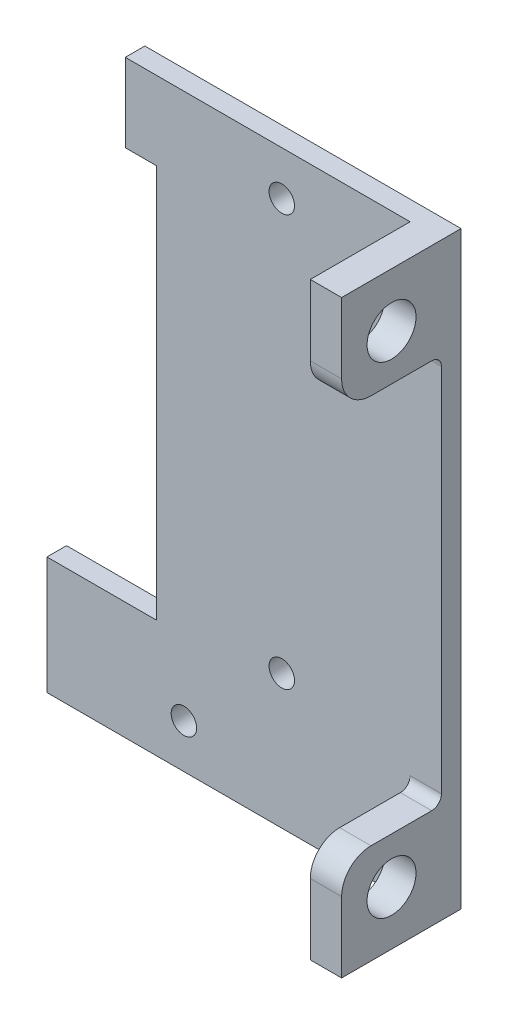
ISO-10303-21;
HEADER;
FILE_DESCRIPTION(('STEP AP214'),'2;1');
FILE_NAME('part.step','',(''),(''),'','','');
FILE_SCHEMA(('AUTOMOTIVE_DESIGN { 1 0 10303 214 1 1 1 1 }'));
ENDSEC;
DATA;
#1=APPLICATION_CONTEXT('core data for automotive mechanical design processes');
#2=APPLICATION_PROTOCOL_DEFINITION('international standard','automotive_design',2000,#1);
#3=PRODUCT_CONTEXT('',#1,'mechanical');
#4=PRODUCT('Part','Part','',(#3));
#5=PRODUCT_RELATED_PRODUCT_CATEGORY('part','',(#4));
#6=PRODUCT_DEFINITION_FORMATION('','',#4);
#7=PRODUCT_DEFINITION_CONTEXT('part definition',#1,'design');
#8=PRODUCT_DEFINITION('design','',#6,#7);
#9=PRODUCT_DEFINITION_SHAPE('','',#8);
#10=(LENGTH_UNIT() NAMED_UNIT(*) SI_UNIT(.MILLI.,.METRE.));
#11=(NAMED_UNIT(*) PLANE_ANGLE_UNIT() SI_UNIT($,.RADIAN.));
#12=(NAMED_UNIT(*) SI_UNIT($,.STERADIAN.) SOLID_ANGLE_UNIT());
#13=UNCERTAINTY_MEASURE_WITH_UNIT(LENGTH_MEASURE(1.E-05),#10,'distance_accuracy_value','');
#14=(GEOMETRIC_REPRESENTATION_CONTEXT(3) GLOBAL_UNCERTAINTY_ASSIGNED_CONTEXT((#13)) GLOBAL_UNIT_ASSIGNED_CONTEXT((#10,
#11,#12)) REPRESENTATION_CONTEXT('',''));
#15=CARTESIAN_POINT('',(0.,0.,0.));
#16=DIRECTION('',(0.,0.,1.));
#17=DIRECTION('',(1.,0.,0.));
#18=AXIS2_PLACEMENT_3D('',#15,#16,#17);
#19=CARTESIAN_POINT('',(21.7999999776483,11.2000001899898,22.1999996647239));
#20=DIRECTION('',(-1.,0.,0.));
#21=DIRECTION('',(0.,0.,1.));
#22=AXIS2_PLACEMENT_3D('',#19,#20,#21);
#23=CYLINDRICAL_SURFACE('',#22,3.);
#24=DIRECTION('',(1.,0.,0.));
#25=VECTOR('',#24,1.);
#26=CARTESIAN_POINT('',(21.7999999776483,14.2000001899898,22.1999996647239));
#27=LINE('',#26,#25);
#28=CARTESIAN_POINT('',(18.5999999776483,14.2000001899898,22.1999996647239));
#29=VERTEX_POINT('',#28);
#30=CARTESIAN_POINT('',(21.7999999776483,14.2000001899898,22.1999996647239));
#31=VERTEX_POINT('',#30);
#32=EDGE_CURVE('E314',#29,#31,#27,.T.);
#33=ORIENTED_EDGE('',*,*,#32,.F.);
#34=CARTESIAN_POINT('',(18.5999999776483,11.2000001899898,22.1999996647239));
#35=DIRECTION('',(1.,0.,0.));
#36=DIRECTION('',(0.,1.,0.));
#37=AXIS2_PLACEMENT_3D('',#34,#35,#36);
#38=CIRCLE('',#37,3.);
#39=CARTESIAN_POINT('',(18.5999999776483,11.2000001899898,25.1999996647239));
#40=VERTEX_POINT('',#39);
#41=EDGE_CURVE('E52',#40,#29,#38,.F.);
#42=ORIENTED_EDGE('',*,*,#41,.F.);
#43=DIRECTION('',(1.,0.,0.));
#44=VECTOR('',#43,1.);
#45=CARTESIAN_POINT('',(21.7999999776483,11.2000001899898,25.1999996647239));
#46=LINE('',#45,#44);
#47=CARTESIAN_POINT('',(21.7999999776483,11.2000001899898,25.1999996647239));
#48=VERTEX_POINT('',#47);
#49=EDGE_CURVE('E318',#48,#40,#46,.F.);
#50=ORIENTED_EDGE('',*,*,#49,.F.);
#51=CARTESIAN_POINT('',(21.7999999776483,11.2000001899898,22.1999996647239));
#52=DIRECTION('',(-1.,0.,0.));
#53=DIRECTION('',(0.,0.,1.));
#54=AXIS2_PLACEMENT_3D('',#51,#52,#53);
#55=CIRCLE('',#54,3.);
#56=EDGE_CURVE('E12',#31,#48,#55,.F.);
#57=ORIENTED_EDGE('',*,*,#56,.F.);
#58=EDGE_LOOP('',(#33,#42,#50,#57));
#59=FACE_BOUND('',#58,.T.);
#60=ADVANCED_FACE('F44',(#59),#23,.T.);
#61=CARTESIAN_POINT('',(0.,57.0000003799796,22.1999996647239));
#62=DIRECTION('',(1.,0.,0.));
#63=DIRECTION('',(0.,0.,-1.));
#64=AXIS2_PLACEMENT_3D('',#61,#62,#63);
#65=CYLINDRICAL_SURFACE('',#64,3.);
#66=DIRECTION('',(1.,0.,0.));
#67=VECTOR('',#66,1.);
#68=CARTESIAN_POINT('',(0.,57.0000003799796,25.1999996647239));
#69=LINE('',#68,#67);
#70=CARTESIAN_POINT('',(18.5999999776483,57.0000003799796,25.1999996647239));
#71=VERTEX_POINT('',#70);
#72=CARTESIAN_POINT('',(21.7999999776483,57.0000003799796,25.1999996647239));
#73=VERTEX_POINT('',#72);
#74=EDGE_CURVE('E277',#71,#73,#69,.T.);
#75=ORIENTED_EDGE('',*,*,#74,.F.);
#76=CARTESIAN_POINT('',(18.5999999776483,57.0000003799796,22.1999996647239));
#77=DIRECTION('',(1.,0.,0.));
#78=DIRECTION('',(0.,0.,-1.));
#79=AXIS2_PLACEMENT_3D('',#76,#77,#78);
#80=CIRCLE('',#79,3.);
#81=CARTESIAN_POINT('',(18.5999999776483,54.0000003799796,22.1999996647239));
#82=VERTEX_POINT('',#81);
#83=EDGE_CURVE('E308',#82,#71,#80,.F.);
#84=ORIENTED_EDGE('',*,*,#83,.F.);
#85=DIRECTION('',(1.,0.,0.));
#86=VECTOR('',#85,1.);
#87=CARTESIAN_POINT('',(21.7999999776483,54.0000003799796,22.1999996647239));
#88=LINE('',#87,#86);
#89=CARTESIAN_POINT('',(21.7999999776483,54.0000003799796,22.1999996647239));
#90=VERTEX_POINT('',#89);
#91=EDGE_CURVE('E304',#90,#82,#88,.F.);
#92=ORIENTED_EDGE('',*,*,#91,.F.);
#93=CARTESIAN_POINT('',(21.7999999776483,57.0000003799796,22.1999996647239));
#94=DIRECTION('',(-1.,0.,0.));
#95=DIRECTION('',(0.,0.,1.));
#96=AXIS2_PLACEMENT_3D('',#93,#94,#95);
#97=CIRCLE('',#96,3.);
#98=EDGE_CURVE('E311',#73,#90,#97,.F.);
#99=ORIENTED_EDGE('',*,*,#98,.F.);
#100=EDGE_LOOP('',(#75,#84,#92,#99));
#101=FACE_BOUND('',#100,.T.);
#102=ADVANCED_FACE('F409',(#101),#65,.T.);
#103=CARTESIAN_POINT('',(21.7999999776483,15.2000001899898,15.9999996647239));
#104=DIRECTION('',(-1.,0.,0.));
#105=DIRECTION('',(0.,0.,1.));
#106=AXIS2_PLACEMENT_3D('',#103,#104,#105);
#107=CYLINDRICAL_SURFACE('',#106,1.);
#108=DIRECTION('',(-1.,0.,0.));
#109=VECTOR('',#108,1.);
#110=CARTESIAN_POINT('',(21.7999999776483,14.2000001899898,15.9999996647239));
#111=LINE('',#110,#109);
#112=CARTESIAN_POINT('',(21.7999999776483,14.2000001899898,15.9999996647239));
#113=VERTEX_POINT('',#112);
#114=CARTESIAN_POINT('',(18.5999999776483,14.2000001899898,15.9999996647239));
#115=VERTEX_POINT('',#114);
#116=EDGE_CURVE('E250',#113,#115,#111,.T.);
#117=ORIENTED_EDGE('',*,*,#116,.F.);
#118=CARTESIAN_POINT('',(21.7999999776483,15.2000001899898,15.9999996647239));
#119=DIRECTION('',(-1.,0.,0.));
#120=DIRECTION('',(0.,0.,1.));
#121=AXIS2_PLACEMENT_3D('',#118,#119,#120);
#122=CIRCLE('',#121,1.);
#123=CARTESIAN_POINT('',(21.7999999776483,15.2000001899898,14.9999996647239));
#124=VERTEX_POINT('',#123);
#125=EDGE_CURVE('E258',#113,#124,#122,.F.);
#126=ORIENTED_EDGE('',*,*,#125,.T.);
#127=DIRECTION('',(-1.,0.,0.));
#128=VECTOR('',#127,1.);
#129=CARTESIAN_POINT('',(0.,15.2000001899898,14.9999996647239));
#130=LINE('',#129,#128);
#131=CARTESIAN_POINT('',(18.5999999776483,15.2000001899898,14.9999996647239));
#132=VERTEX_POINT('',#131);
#133=EDGE_CURVE('E254',#132,#124,#130,.F.);
#134=ORIENTED_EDGE('',*,*,#133,.F.);
#135=CARTESIAN_POINT('',(18.5999999776483,15.2000001899898,15.9999996647239));
#136=DIRECTION('',(1.,0.,0.));
#137=DIRECTION('',(0.,1.,0.));
#138=AXIS2_PLACEMENT_3D('',#135,#136,#137);
#139=CIRCLE('',#138,1.);
#140=EDGE_CURVE('E261',#132,#115,#139,.F.);
#141=ORIENTED_EDGE('',*,*,#140,.T.);
#142=EDGE_LOOP('',(#117,#126,#134,#141));
#143=FACE_BOUND('',#142,.T.);
#144=ADVANCED_FACE('F424',(#143),#107,.F.);
#145=CARTESIAN_POINT('',(21.7999999776483,53.0000003799796,15.9999996647239));
#146=DIRECTION('',(1.,0.,0.));
#147=DIRECTION('',(0.,0.,-1.));
#148=AXIS2_PLACEMENT_3D('',#145,#146,#147);
#149=CYLINDRICAL_SURFACE('',#148,1.);
#150=DIRECTION('',(1.,0.,0.));
#151=VECTOR('',#150,1.);
#152=CARTESIAN_POINT('',(21.7999999776483,54.0000003799796,15.9999996647239));
#153=LINE('',#152,#151);
#154=CARTESIAN_POINT('',(18.5999999776483,54.0000003799796,15.9999996647239));
#155=VERTEX_POINT('',#154);
#156=CARTESIAN_POINT('',(21.7999999776483,54.0000003799796,15.9999996647239));
#157=VERTEX_POINT('',#156);
#158=EDGE_CURVE('E226',#155,#157,#153,.T.);
#159=ORIENTED_EDGE('',*,*,#158,.F.);
#160=CARTESIAN_POINT('',(18.5999999776483,53.0000003799796,15.9999996647239));
#161=DIRECTION('',(1.,0.,0.));
#162=DIRECTION('',(0.,0.,-1.));
#163=AXIS2_PLACEMENT_3D('',#160,#161,#162);
#164=CIRCLE('',#163,1.);
#165=CARTESIAN_POINT('',(18.5999999776483,53.0000003799796,14.9999996647239));
#166=VERTEX_POINT('',#165);
#167=EDGE_CURVE('E242',#155,#166,#164,.F.);
#168=ORIENTED_EDGE('',*,*,#167,.T.);
#169=DIRECTION('',(1.,0.,0.));
#170=VECTOR('',#169,1.);
#171=CARTESIAN_POINT('',(0.,53.0000003799796,14.9999996647239));
#172=LINE('',#171,#170);
#173=CARTESIAN_POINT('',(21.7999999776483,53.0000003799796,14.9999996647239));
#174=VERTEX_POINT('',#173);
#175=EDGE_CURVE('E238',#174,#166,#172,.F.);
#176=ORIENTED_EDGE('',*,*,#175,.F.);
#177=CARTESIAN_POINT('',(21.7999999776483,53.0000003799796,15.9999996647239));
#178=DIRECTION('',(-1.,0.,0.));
#179=DIRECTION('',(0.,0.,1.));
#180=AXIS2_PLACEMENT_3D('',#177,#178,#179);
#181=CIRCLE('',#180,1.);
#182=EDGE_CURVE('E246',#174,#157,#181,.F.);
#183=ORIENTED_EDGE('',*,*,#182,.T.);
#184=EDGE_LOOP('',(#159,#168,#176,#183));
#185=FACE_BOUND('',#184,.T.);
#186=ADVANCED_FACE('F417',(#185),#149,.F.);
#187=CARTESIAN_POINT('',(0.,0.,14.9999996647239));
#188=DIRECTION('',(0.,0.,1.));
#189=DIRECTION('',(1.,0.,0.));
#190=AXIS2_PLACEMENT_3D('',#187,#188,#189);
#191=PLANE('',#190);
#192=CARTESIAN_POINT('',(5.48763696421706,59.7000003799796,14.9999996647239));
#193=DIRECTION('',(0.,0.,1.));
#194=DIRECTION('',(1.,0.,0.));
#195=AXIS2_PLACEMENT_3D('',#192,#193,#194);
#196=CIRCLE('',#195,1.3);
#197=CARTESIAN_POINT('',(6.78763696421706,59.7000003799796,14.9999996647239));
#198=VERTEX_POINT('',#197);
#199=EDGE_CURVE('E292',#198,#198,#196,.T.);
#200=ORIENTED_EDGE('',*,*,#199,.F.);
#201=EDGE_LOOP('',(#200));
#202=FACE_BOUND('',#201,.T.);
#203=CARTESIAN_POINT('',(5.48763696421707,17.7000003799796,14.9999996647239));
#204=DIRECTION('',(0.,0.,1.));
#205=DIRECTION('',(1.,0.,0.));
#206=AXIS2_PLACEMENT_3D('',#203,#204,#205);
#207=CIRCLE('',#206,1.3);
#208=CARTESIAN_POINT('',(6.78763696421706,17.7000003799796,14.9999996647239));
#209=VERTEX_POINT('',#208);
#210=EDGE_CURVE('E741',#209,#209,#207,.T.);
#211=ORIENTED_EDGE('',*,*,#210,.F.);
#212=EDGE_LOOP('',(#211));
#213=FACE_BOUND('',#212,.T.);
#214=CARTESIAN_POINT('',(-4.51236303578294,8.50000018998981,14.9999996647239));
#215=DIRECTION('',(0.,0.,1.));
#216=DIRECTION('',(1.,0.,0.));
#217=AXIS2_PLACEMENT_3D('',#214,#215,#216);
#218=CIRCLE('',#217,1.3);
#219=CARTESIAN_POINT('',(-3.21236303578294,8.50000018998981,14.9999996647239));
#220=VERTEX_POINT('',#219);
#221=EDGE_CURVE('E737',#220,#220,#218,.T.);
#222=ORIENTED_EDGE('',*,*,#221,.F.);
#223=EDGE_LOOP('',(#222));
#224=FACE_BOUND('',#223,.T.);
#225=DIRECTION('',(-1.,0.,0.));
#226=VECTOR('',#225,1.);
#227=CARTESIAN_POINT('',(-7.30000002235174,56.2000003799796,14.9999996647239));
#228=LINE('',#227,#226);
#229=CARTESIAN_POINT('',(-7.30000002235174,56.2000003799796,14.9999996647239));
#230=VERTEX_POINT('',#229);
#231=CARTESIAN_POINT('',(-10.5000000223517,56.2000003799796,14.9999996647239));
#232=VERTEX_POINT('',#231);
#233=EDGE_CURVE('E204',#230,#232,#228,.T.);
#234=ORIENTED_EDGE('',*,*,#233,.F.);
#235=DIRECTION('',(0.,1.,0.));
#236=VECTOR('',#235,1.);
#237=CARTESIAN_POINT('',(-7.30000002235174,16.0000003799796,14.9999996647239));
#238=LINE('',#237,#236);
#239=CARTESIAN_POINT('',(-7.30000002235174,16.0000003799796,14.9999996647239));
#240=VERTEX_POINT('',#239);
#241=EDGE_CURVE('E193',#240,#230,#238,.T.);
#242=ORIENTED_EDGE('',*,*,#241,.F.);
#243=DIRECTION('',(1.,0.,0.));
#244=VECTOR('',#243,1.);
#245=CARTESIAN_POINT('',(-18.5000000223517,16.0000003799796,14.9999996647239));
#246=LINE('',#245,#244);
#247=CARTESIAN_POINT('',(-18.5000000223517,16.0000003799796,14.9999996647239));
#248=VERTEX_POINT('',#247);
#249=EDGE_CURVE('E183',#248,#240,#246,.T.);
#250=ORIENTED_EDGE('',*,*,#249,.F.);
#251=DIRECTION('',(0.,-1.,0.));
#252=VECTOR('',#251,1.);
#253=CARTESIAN_POINT('',(-18.5000000223517,0.,14.9999996647239));
#254=LINE('',#253,#252);
#255=CARTESIAN_POINT('',(-18.5000000223517,4.00000018998981,14.9999996647239));
#256=VERTEX_POINT('',#255);
#257=EDGE_CURVE('E200',#248,#256,#254,.T.);
#258=ORIENTED_EDGE('',*,*,#257,.T.);
#259=DIRECTION('',(-1.,0.,0.));
#260=VECTOR('',#259,1.);
#261=CARTESIAN_POINT('',(9.9119832739234,4.00000018998981,14.9999996647239));
#262=LINE('',#261,#260);
#263=CARTESIAN_POINT('',(18.5999999776483,4.00000018998981,14.9999996647239));
#264=VERTEX_POINT('',#263);
#265=EDGE_CURVE('E223',#264,#256,#262,.T.);
#266=ORIENTED_EDGE('',*,*,#265,.F.);
#267=DIRECTION('',(0.,-1.,0.));
#268=VECTOR('',#267,1.);
#269=CARTESIAN_POINT('',(18.5999999776483,14.2000001899898,14.9999996647239));
#270=LINE('',#269,#268);
#271=EDGE_CURVE('E426',#132,#264,#270,.T.);
#272=ORIENTED_EDGE('',*,*,#271,.F.);
#273=ORIENTED_EDGE('',*,*,#133,.T.);
#274=DIRECTION('',(0.,-1.,0.));
#275=VECTOR('',#274,1.);
#276=CARTESIAN_POINT('',(21.7999999776483,4.00000018998981,14.9999996647239));
#277=LINE('',#276,#275);
#278=EDGE_CURVE('E378',#174,#124,#277,.T.);
#279=ORIENTED_EDGE('',*,*,#278,.F.);
#280=ORIENTED_EDGE('',*,*,#175,.T.);
#281=DIRECTION('',(0.,-1.,0.));
#282=VECTOR('',#281,1.);
#283=CARTESIAN_POINT('',(18.5999999776483,54.0000003799796,14.9999996647239));
#284=LINE('',#283,#282);
#285=CARTESIAN_POINT('',(18.5999999776483,64.2000003799796,14.9999996647239));
#286=VERTEX_POINT('',#285);
#287=EDGE_CURVE('E338',#286,#166,#284,.T.);
#288=ORIENTED_EDGE('',*,*,#287,.F.);
#289=DIRECTION('',(1.,0.,0.));
#290=VECTOR('',#289,1.);
#291=CARTESIAN_POINT('',(21.7999999776483,64.2000003799796,14.9999996647239));
#292=LINE('',#291,#290);
#293=CARTESIAN_POINT('',(-10.5000000223517,64.2000003799796,14.9999996647239));
#294=VERTEX_POINT('',#293);
#295=EDGE_CURVE('E375',#294,#286,#292,.T.);
#296=ORIENTED_EDGE('',*,*,#295,.F.);
#297=DIRECTION('',(0.,1.,0.));
#298=VECTOR('',#297,1.);
#299=CARTESIAN_POINT('',(-10.5000000223517,64.2000003799796,14.9999996647239));
#300=LINE('',#299,#298);
#301=EDGE_CURVE('E721',#232,#294,#300,.T.);
#302=ORIENTED_EDGE('',*,*,#301,.F.);
#303=EDGE_LOOP('',(#234,#242,#250,#258,#266,#272,#273,#279,#280,#288,#296,#302));
#304=FACE_BOUND('',#303,.T.);
#305=DIRECTION('',(0.979819778207495,-0.199882971344276,0.));
#306=VECTOR('',#305,1.);
#307=CARTESIAN_POINT('',(-9.69588663429022,8.00000037997961,14.9999996647239));
#308=LINE('',#307,#306);
#309=CARTESIAN_POINT('',(-9.69588663429022,8.00000037997961,14.9999996647239));
#310=VERTEX_POINT('',#309);
#311=CARTESIAN_POINT('',(9.49999997764826,4.08404467167432,14.9999996647239));
#312=VERTEX_POINT('',#311);
#313=EDGE_CURVE('E227',#310,#312,#308,.T.);
#314=ORIENTED_EDGE('',*,*,#313,.F.);
#315=ORIENTED_EDGE('',*,*,#313,.T.);
#316=EDGE_LOOP('',(#314,#315));
#317=FACE_BOUND('',#316,.T.);
#318=ADVANCED_FACE('F198',(#202,#213,#224,#304,#317),#191,.T.);
#319=CARTESIAN_POINT('',(0.,0.,13.0000002682209));
#320=DIRECTION('',(0.,0.,1.));
#321=DIRECTION('',(1.,0.,0.));
#322=AXIS2_PLACEMENT_3D('',#319,#320,#321);
#323=PLANE('',#322);
#324=CARTESIAN_POINT('',(5.48763696421706,59.7000003799796,13.0000002682209));
#325=DIRECTION('',(0.,0.,1.));
#326=DIRECTION('',(1.,0.,0.));
#327=AXIS2_PLACEMENT_3D('',#324,#325,#326);
#328=CIRCLE('',#327,1.3);
#329=CARTESIAN_POINT('',(6.78763696421706,59.7000003799796,13.0000002682209));
#330=VERTEX_POINT('',#329);
#331=EDGE_CURVE('E296',#330,#330,#328,.T.);
#332=ORIENTED_EDGE('',*,*,#331,.T.);
#333=EDGE_LOOP('',(#332));
#334=FACE_BOUND('',#333,.T.);
#335=CARTESIAN_POINT('',(5.48763696421707,17.7000003799796,13.0000002682209));
#336=DIRECTION('',(0.,0.,1.));
#337=DIRECTION('',(1.,0.,0.));
#338=AXIS2_PLACEMENT_3D('',#335,#336,#337);
#339=CIRCLE('',#338,1.3);
#340=CARTESIAN_POINT('',(6.78763696421706,17.7000003799796,13.0000002682209));
#341=VERTEX_POINT('',#340);
#342=EDGE_CURVE('E291',#341,#341,#339,.T.);
#343=ORIENTED_EDGE('',*,*,#342,.T.);
#344=EDGE_LOOP('',(#343));
#345=FACE_BOUND('',#344,.T.);
#346=CARTESIAN_POINT('',(-4.51236303578294,8.50000018998981,13.0000002682209));
#347=DIRECTION('',(0.,0.,1.));
#348=DIRECTION('',(1.,0.,0.));
#349=AXIS2_PLACEMENT_3D('',#346,#347,#348);
#350=CIRCLE('',#349,1.3);
#351=CARTESIAN_POINT('',(-3.21236303578294,8.50000018998981,13.0000002682209));
#352=VERTEX_POINT('',#351);
#353=EDGE_CURVE('E287',#352,#352,#350,.T.);
#354=ORIENTED_EDGE('',*,*,#353,.T.);
#355=EDGE_LOOP('',(#354));
#356=FACE_BOUND('',#355,.T.);
#357=DIRECTION('',(0.,1.,0.));
#358=VECTOR('',#357,1.);
#359=CARTESIAN_POINT('',(-7.30000002235174,0.,13.0000002682209));
#360=LINE('',#359,#358);
#361=CARTESIAN_POINT('',(-7.30000002235174,16.0000003799796,13.0000002682209));
#362=VERTEX_POINT('',#361);
#363=CARTESIAN_POINT('',(-7.30000002235174,56.2000003799796,13.0000002682209));
#364=VERTEX_POINT('',#363);
#365=EDGE_CURVE('E273',#362,#364,#360,.T.);
#366=ORIENTED_EDGE('',*,*,#365,.T.);
#367=DIRECTION('',(-1.,0.,0.));
#368=VECTOR('',#367,1.);
#369=CARTESIAN_POINT('',(0.,56.2000003799796,13.0000002682209));
#370=LINE('',#369,#368);
#371=CARTESIAN_POINT('',(-10.5000000223517,56.2000003799796,13.0000002682209));
#372=VERTEX_POINT('',#371);
#373=EDGE_CURVE('E714',#364,#372,#370,.T.);
#374=ORIENTED_EDGE('',*,*,#373,.T.);
#375=DIRECTION('',(0.,1.,0.));
#376=VECTOR('',#375,1.);
#377=CARTESIAN_POINT('',(-10.5000000223517,0.,13.0000002682209));
#378=LINE('',#377,#376);
#379=CARTESIAN_POINT('',(-10.5000000223517,64.2000003799796,13.0000002682209));
#380=VERTEX_POINT('',#379);
#381=EDGE_CURVE('E397',#372,#380,#378,.T.);
#382=ORIENTED_EDGE('',*,*,#381,.T.);
#383=DIRECTION('',(-1.,0.,0.));
#384=VECTOR('',#383,1.);
#385=CARTESIAN_POINT('',(-18.5000000223517,64.2000003799796,13.0000002682209));
#386=LINE('',#385,#384);
#387=CARTESIAN_POINT('',(21.7999999776483,64.2000003799796,13.0000002682209));
#388=VERTEX_POINT('',#387);
#389=EDGE_CURVE('E371',#388,#380,#386,.T.);
#390=ORIENTED_EDGE('',*,*,#389,.F.);
#391=DIRECTION('',(0.,1.,0.));
#392=VECTOR('',#391,1.);
#393=CARTESIAN_POINT('',(21.7999999776483,8.00000037997961,13.0000002682209));
#394=LINE('',#393,#392);
#395=CARTESIAN_POINT('',(21.7999999776483,4.00000018998981,13.0000002682209));
#396=VERTEX_POINT('',#395);
#397=EDGE_CURVE('E210',#396,#388,#394,.T.);
#398=ORIENTED_EDGE('',*,*,#397,.F.);
#399=DIRECTION('',(1.,0.,0.));
#400=VECTOR('',#399,1.);
#401=CARTESIAN_POINT('',(-11.5000000223517,4.00000018998981,13.0000002682209));
#402=LINE('',#401,#400);
#403=CARTESIAN_POINT('',(-18.5000000223517,4.00000018998981,13.0000002682209));
#404=VERTEX_POINT('',#403);
#405=EDGE_CURVE('E222',#404,#396,#402,.T.);
#406=ORIENTED_EDGE('',*,*,#405,.F.);
#407=DIRECTION('',(0.,1.,0.));
#408=VECTOR('',#407,1.);
#409=CARTESIAN_POINT('',(-18.5000000223517,0.,13.0000002682209));
#410=LINE('',#409,#408);
#411=CARTESIAN_POINT('',(-18.5000000223517,16.0000003799796,13.0000002682209));
#412=VERTEX_POINT('',#411);
#413=EDGE_CURVE('E214',#404,#412,#410,.T.);
#414=ORIENTED_EDGE('',*,*,#413,.T.);
#415=DIRECTION('',(1.,0.,0.));
#416=VECTOR('',#415,1.);
#417=CARTESIAN_POINT('',(0.,16.0000003799796,13.0000002682209));
#418=LINE('',#417,#416);
#419=EDGE_CURVE('E186',#412,#362,#418,.T.);
#420=ORIENTED_EDGE('',*,*,#419,.T.);
#421=EDGE_LOOP('',(#366,#374,#382,#390,#398,#406,#414,#420));
#422=FACE_BOUND('',#421,.T.);
#423=DIRECTION('',(-0.985211753502092,0.171341182327348,0.));
#424=VECTOR('',#423,1.);
#425=CARTESIAN_POINT('',(11.5000000223517,4.00000018998981,13.0000002682209));
#426=LINE('',#425,#424);
#427=CARTESIAN_POINT('',(9.49999997764826,4.34782630056565,13.0000002682209));
#428=VERTEX_POINT('',#427);
#429=CARTESIAN_POINT('',(-11.5000000223517,8.00000037997961,13.0000002682209));
#430=VERTEX_POINT('',#429);
#431=EDGE_CURVE('E230',#428,#430,#426,.T.);
#432=ORIENTED_EDGE('',*,*,#431,.T.);
#433=ORIENTED_EDGE('',*,*,#431,.F.);
#434=EDGE_LOOP('',(#432,#433));
#435=FACE_BOUND('',#434,.T.);
#436=ADVANCED_FACE('F393',(#334,#345,#356,#422,#435),#323,.F.);
#437=CARTESIAN_POINT('',(-18.5000000223517,4.00000018998981,0.));
#438=DIRECTION('',(0.,-1.,0.));
#439=DIRECTION('',(0.,0.,-1.));
#440=AXIS2_PLACEMENT_3D('',#437,#438,#439);
#441=PLANE('',#440);
#442=DIRECTION('',(0.,0.,-1.));
#443=VECTOR('',#442,1.);
#444=CARTESIAN_POINT('',(-18.5000000223517,4.00000018998981,0.));
#445=LINE('',#444,#443);
#446=EDGE_CURVE('E208',#256,#404,#445,.T.);
#447=ORIENTED_EDGE('',*,*,#446,.T.);
#448=ORIENTED_EDGE('',*,*,#405,.T.);
#449=DIRECTION('',(0.,0.,-1.));
#450=VECTOR('',#449,1.);
#451=CARTESIAN_POINT('',(21.7999999776483,4.00000018998981,13.0000002682209));
#452=LINE('',#451,#450);
#453=CARTESIAN_POINT('',(21.7999999776483,4.00000018998981,25.1999996647239));
#454=VERTEX_POINT('',#453);
#455=EDGE_CURVE('E216',#454,#396,#452,.T.);
#456=ORIENTED_EDGE('',*,*,#455,.F.);
#457=DIRECTION('',(1.,0.,0.));
#458=VECTOR('',#457,1.);
#459=CARTESIAN_POINT('',(18.5999999776483,4.00000018998981,25.1999996647239));
#460=LINE('',#459,#458);
#461=CARTESIAN_POINT('',(18.5999999776483,4.00000018998981,25.1999996647239));
#462=VERTEX_POINT('',#461);
#463=EDGE_CURVE('E428',#462,#454,#460,.T.);
#464=ORIENTED_EDGE('',*,*,#463,.F.);
#465=DIRECTION('',(0.,0.,-1.));
#466=VECTOR('',#465,1.);
#467=CARTESIAN_POINT('',(18.5999999776483,4.00000018998981,25.1999996647239));
#468=LINE('',#467,#466);
#469=EDGE_CURVE('E334',#462,#264,#468,.T.);
#470=ORIENTED_EDGE('',*,*,#469,.T.);
#471=ORIENTED_EDGE('',*,*,#265,.T.);
#472=EDGE_LOOP('',(#447,#448,#456,#464,#470,#471));
#473=FACE_BOUND('',#472,.T.);
#474=ADVANCED_FACE('F429',(#473),#441,.T.);
#475=CARTESIAN_POINT('',(-18.5000000223517,0.,0.));
#476=DIRECTION('',(1.,0.,0.));
#477=DIRECTION('',(0.,0.,-1.));
#478=AXIS2_PLACEMENT_3D('',#475,#476,#477);
#479=PLANE('',#478);
#480=ORIENTED_EDGE('',*,*,#257,.F.);
#481=DIRECTION('',(0.,0.,1.));
#482=VECTOR('',#481,1.);
#483=CARTESIAN_POINT('',(-18.5000000223517,16.0000003799796,4.79999966472387));
#484=LINE('',#483,#482);
#485=EDGE_CURVE('E179',#412,#248,#484,.T.);
#486=ORIENTED_EDGE('',*,*,#485,.F.);
#487=ORIENTED_EDGE('',*,*,#413,.F.);
#488=ORIENTED_EDGE('',*,*,#446,.F.);
#489=EDGE_LOOP('',(#480,#486,#487,#488));
#490=FACE_BOUND('',#489,.T.);
#491=ADVANCED_FACE('F206',(#490),#479,.F.);
#492=CARTESIAN_POINT('',(21.7999999776483,0.,0.));
#493=DIRECTION('',(-1.,0.,0.));
#494=DIRECTION('',(0.,0.,1.));
#495=AXIS2_PLACEMENT_3D('',#492,#493,#494);
#496=PLANE('',#495);
#497=CARTESIAN_POINT('',(21.7999999776483,58.7000003799796,20.1000002682209));
#498=DIRECTION('',(1.,0.,0.));
#499=DIRECTION('',(0.,0.,-1.));
#500=AXIS2_PLACEMENT_3D('',#497,#498,#499);
#501=CIRCLE('',#500,2.5);
#502=CARTESIAN_POINT('',(21.7999999776483,58.7000003799796,17.6000002682209));
#503=VERTEX_POINT('',#502);
#504=EDGE_CURVE('E283',#503,#503,#501,.T.);
#505=ORIENTED_EDGE('',*,*,#504,.F.);
#506=EDGE_LOOP('',(#505));
#507=FACE_BOUND('',#506,.T.);
#508=CARTESIAN_POINT('',(21.7999999776483,9.5000001899898,20.1000002682209));
#509=DIRECTION('',(1.,0.,0.));
#510=DIRECTION('',(0.,0.,1.));
#511=AXIS2_PLACEMENT_3D('',#508,#509,#510);
#512=CIRCLE('',#511,2.5);
#513=CARTESIAN_POINT('',(21.7999999776483,9.5000001899898,22.6000002682209));
#514=VERTEX_POINT('',#513);
#515=EDGE_CURVE('E300',#514,#514,#512,.T.);
#516=ORIENTED_EDGE('',*,*,#515,.F.);
#517=EDGE_LOOP('',(#516));
#518=FACE_BOUND('',#517,.T.);
#519=DIRECTION('',(0.,0.,-1.));
#520=VECTOR('',#519,1.);
#521=CARTESIAN_POINT('',(21.7999999776483,14.2000001899898,25.1999996647239));
#522=LINE('',#521,#520);
#523=EDGE_CURVE('E333',#31,#113,#522,.T.);
#524=ORIENTED_EDGE('',*,*,#523,.F.);
#525=ORIENTED_EDGE('',*,*,#56,.T.);
#526=DIRECTION('',(0.,1.,0.));
#527=VECTOR('',#526,1.);
#528=CARTESIAN_POINT('',(21.7999999776483,4.00000018998981,25.1999996647239));
#529=LINE('',#528,#527);
#530=EDGE_CURVE('E388',#454,#48,#529,.T.);
#531=ORIENTED_EDGE('',*,*,#530,.F.);
#532=ORIENTED_EDGE('',*,*,#455,.T.);
#533=ORIENTED_EDGE('',*,*,#397,.T.);
#534=DIRECTION('',(0.,0.,-1.));
#535=VECTOR('',#534,1.);
#536=CARTESIAN_POINT('',(21.7999999776483,64.2000003799796,13.0000002682209));
#537=LINE('',#536,#535);
#538=CARTESIAN_POINT('',(21.7999999776483,64.2000003799796,25.1999996647239));
#539=VERTEX_POINT('',#538);
#540=EDGE_CURVE('E367',#539,#388,#537,.T.);
#541=ORIENTED_EDGE('',*,*,#540,.F.);
#542=DIRECTION('',(0.,1.,0.));
#543=VECTOR('',#542,1.);
#544=CARTESIAN_POINT('',(21.7999999776483,64.2000003799796,25.1999996647239));
#545=LINE('',#544,#543);
#546=EDGE_CURVE('E352',#73,#539,#545,.T.);
#547=ORIENTED_EDGE('',*,*,#546,.F.);
#548=ORIENTED_EDGE('',*,*,#98,.T.);
#549=DIRECTION('',(0.,0.,-1.));
#550=VECTOR('',#549,1.);
#551=CARTESIAN_POINT('',(21.7999999776483,54.0000003799796,25.1999996647239));
#552=LINE('',#551,#550);
#553=EDGE_CURVE('E355',#90,#157,#552,.T.);
#554=ORIENTED_EDGE('',*,*,#553,.T.);
#555=ORIENTED_EDGE('',*,*,#182,.F.);
#556=ORIENTED_EDGE('',*,*,#278,.T.);
#557=ORIENTED_EDGE('',*,*,#125,.F.);
#558=EDGE_LOOP('',(#524,#525,#531,#532,#533,#541,#547,#548,#554,#555,#556,#557));
#559=FACE_BOUND('',#558,.T.);
#560=ADVANCED_FACE('F384',(#507,#518,#559),#496,.F.);
#561=CARTESIAN_POINT('',(0.,64.2000003799796,0.));
#562=DIRECTION('',(0.,-1.,0.));
#563=DIRECTION('',(0.,0.,-1.));
#564=AXIS2_PLACEMENT_3D('',#561,#562,#563);
#565=PLANE('',#564);
#566=ORIENTED_EDGE('',*,*,#389,.T.);
#567=DIRECTION('',(0.,0.,1.));
#568=VECTOR('',#567,1.);
#569=CARTESIAN_POINT('',(-10.5000000223517,64.2000003799796,0.));
#570=LINE('',#569,#568);
#571=EDGE_CURVE('E265',#380,#294,#570,.T.);
#572=ORIENTED_EDGE('',*,*,#571,.T.);
#573=ORIENTED_EDGE('',*,*,#295,.T.);
#574=DIRECTION('',(0.,0.,-1.));
#575=VECTOR('',#574,1.);
#576=CARTESIAN_POINT('',(18.5999999776483,64.2000003799796,25.1999996647239));
#577=LINE('',#576,#575);
#578=CARTESIAN_POINT('',(18.5999999776483,64.2000003799796,25.1999996647239));
#579=VERTEX_POINT('',#578);
#580=EDGE_CURVE('E363',#579,#286,#577,.T.);
#581=ORIENTED_EDGE('',*,*,#580,.F.);
#582=DIRECTION('',(-1.,0.,0.));
#583=VECTOR('',#582,1.);
#584=CARTESIAN_POINT('',(18.5999999776483,64.2000003799796,25.1999996647239));
#585=LINE('',#584,#583);
#586=EDGE_CURVE('E344',#539,#579,#585,.T.);
#587=ORIENTED_EDGE('',*,*,#586,.F.);
#588=ORIENTED_EDGE('',*,*,#540,.T.);
#589=EDGE_LOOP('',(#566,#572,#573,#581,#587,#588));
#590=FACE_BOUND('',#589,.T.);
#591=ADVANCED_FACE('F401',(#590),#565,.F.);
#592=CARTESIAN_POINT('',(18.5999999776483,54.0000003799796,25.1999996647239));
#593=DIRECTION('',(1.,0.,0.));
#594=DIRECTION('',(0.,0.,-1.));
#595=AXIS2_PLACEMENT_3D('',#592,#593,#594);
#596=PLANE('',#595);
#597=CARTESIAN_POINT('',(18.5999999776483,58.7000003799796,20.1000002682209));
#598=DIRECTION('',(1.,0.,0.));
#599=DIRECTION('',(0.,0.,-1.));
#600=AXIS2_PLACEMENT_3D('',#597,#598,#599);
#601=CIRCLE('',#600,2.5);
#602=CARTESIAN_POINT('',(18.5999999776483,58.7000003799796,17.6000002682209));
#603=VERTEX_POINT('',#602);
#604=EDGE_CURVE('E282',#603,#603,#601,.T.);
#605=ORIENTED_EDGE('',*,*,#604,.T.);
#606=EDGE_LOOP('',(#605));
#607=FACE_BOUND('',#606,.T.);
#608=DIRECTION('',(0.,0.,-1.));
#609=VECTOR('',#608,1.);
#610=CARTESIAN_POINT('',(18.5999999776483,54.0000003799796,25.1999996647239));
#611=LINE('',#610,#609);
#612=EDGE_CURVE('E360',#82,#155,#611,.T.);
#613=ORIENTED_EDGE('',*,*,#612,.F.);
#614=ORIENTED_EDGE('',*,*,#83,.T.);
#615=DIRECTION('',(0.,-1.,0.));
#616=VECTOR('',#615,1.);
#617=CARTESIAN_POINT('',(18.5999999776483,54.0000003799796,25.1999996647239));
#618=LINE('',#617,#616);
#619=EDGE_CURVE('E348',#579,#71,#618,.T.);
#620=ORIENTED_EDGE('',*,*,#619,.F.);
#621=ORIENTED_EDGE('',*,*,#580,.T.);
#622=ORIENTED_EDGE('',*,*,#287,.T.);
#623=ORIENTED_EDGE('',*,*,#167,.F.);
#624=EDGE_LOOP('',(#613,#614,#620,#621,#622,#623));
#625=FACE_BOUND('',#624,.T.);
#626=ADVANCED_FACE('F478',(#607,#625),#596,.F.);
#627=CARTESIAN_POINT('',(21.7999999776483,54.0000003799796,25.1999996647239));
#628=DIRECTION('',(0.,1.,0.));
#629=DIRECTION('',(0.,0.,1.));
#630=AXIS2_PLACEMENT_3D('',#627,#628,#629);
#631=PLANE('',#630);
#632=ORIENTED_EDGE('',*,*,#553,.F.);
#633=ORIENTED_EDGE('',*,*,#91,.T.);
#634=ORIENTED_EDGE('',*,*,#612,.T.);
#635=ORIENTED_EDGE('',*,*,#158,.T.);
#636=EDGE_LOOP('',(#632,#633,#634,#635));
#637=FACE_BOUND('',#636,.T.);
#638=ADVANCED_FACE('F413',(#637),#631,.F.);
#639=CARTESIAN_POINT('',(0.,0.,25.1999996647239));
#640=DIRECTION('',(0.,0.,-1.));
#641=DIRECTION('',(-1.,0.,0.));
#642=AXIS2_PLACEMENT_3D('',#639,#640,#641);
#643=PLANE('',#642);
#644=ORIENTED_EDGE('',*,*,#619,.T.);
#645=ORIENTED_EDGE('',*,*,#74,.T.);
#646=ORIENTED_EDGE('',*,*,#546,.T.);
#647=ORIENTED_EDGE('',*,*,#586,.T.);
#648=EDGE_LOOP('',(#644,#645,#646,#647));
#649=FACE_BOUND('',#648,.T.);
#650=ADVANCED_FACE('F406',(#649),#643,.F.);
#651=CARTESIAN_POINT('',(21.7999999776483,14.2000001899898,25.1999996647239));
#652=DIRECTION('',(0.,-1.,0.));
#653=DIRECTION('',(0.,0.,-1.));
#654=AXIS2_PLACEMENT_3D('',#651,#652,#653);
#655=PLANE('',#654);
#656=DIRECTION('',(0.,0.,-1.));
#657=VECTOR('',#656,1.);
#658=CARTESIAN_POINT('',(18.5999999776483,14.2000001899898,25.1999996647239));
#659=LINE('',#658,#657);
#660=EDGE_CURVE('E326',#29,#115,#659,.T.);
#661=ORIENTED_EDGE('',*,*,#660,.F.);
#662=ORIENTED_EDGE('',*,*,#32,.T.);
#663=ORIENTED_EDGE('',*,*,#523,.T.);
#664=ORIENTED_EDGE('',*,*,#116,.T.);
#665=EDGE_LOOP('',(#661,#662,#663,#664));
#666=FACE_BOUND('',#665,.T.);
#667=ADVANCED_FACE('F330',(#666),#655,.F.);
#668=CARTESIAN_POINT('',(18.5999999776483,14.2000001899898,25.1999996647239));
#669=DIRECTION('',(1.,0.,0.));
#670=DIRECTION('',(0.,1.,0.));
#671=AXIS2_PLACEMENT_3D('',#668,#669,#670);
#672=PLANE('',#671);
#673=CARTESIAN_POINT('',(18.5999999776483,9.5000001899898,20.1000002682209));
#674=DIRECTION('',(1.,0.,0.));
#675=DIRECTION('',(0.,1.,0.));
#676=AXIS2_PLACEMENT_3D('',#673,#674,#675);
#677=CIRCLE('',#676,2.5);
#678=CARTESIAN_POINT('',(18.5999999776483,12.0000001899898,20.1000002682209));
#679=VERTEX_POINT('',#678);
#680=EDGE_CURVE('E278',#679,#679,#677,.T.);
#681=ORIENTED_EDGE('',*,*,#680,.T.);
#682=EDGE_LOOP('',(#681));
#683=FACE_BOUND('',#682,.T.);
#684=DIRECTION('',(0.,-1.,0.));
#685=VECTOR('',#684,1.);
#686=CARTESIAN_POINT('',(18.5999999776483,14.2000001899898,25.1999996647239));
#687=LINE('',#686,#685);
#688=EDGE_CURVE('E328',#40,#462,#687,.T.);
#689=ORIENTED_EDGE('',*,*,#688,.F.);
#690=ORIENTED_EDGE('',*,*,#41,.T.);
#691=ORIENTED_EDGE('',*,*,#660,.T.);
#692=ORIENTED_EDGE('',*,*,#140,.F.);
#693=ORIENTED_EDGE('',*,*,#271,.T.);
#694=ORIENTED_EDGE('',*,*,#469,.F.);
#695=EDGE_LOOP('',(#689,#690,#691,#692,#693,#694));
#696=FACE_BOUND('',#695,.T.);
#697=ADVANCED_FACE('F323',(#683,#696),#672,.F.);
#698=CARTESIAN_POINT('',(0.,0.,25.1999996647239));
#699=DIRECTION('',(0.,0.,1.));
#700=DIRECTION('',(1.,0.,0.));
#701=AXIS2_PLACEMENT_3D('',#698,#699,#700);
#702=PLANE('',#701);
#703=ORIENTED_EDGE('',*,*,#530,.T.);
#704=ORIENTED_EDGE('',*,*,#49,.T.);
#705=ORIENTED_EDGE('',*,*,#688,.T.);
#706=ORIENTED_EDGE('',*,*,#463,.T.);
#707=EDGE_LOOP('',(#703,#704,#705,#706));
#708=FACE_BOUND('',#707,.T.);
#709=ADVANCED_FACE('F439',(#708),#702,.T.);
#710=CARTESIAN_POINT('',(-10.5000000223517,64.2000003799796,4.79999966472387));
#711=DIRECTION('',(1.,0.,0.));
#712=DIRECTION('',(0.,1.,0.));
#713=AXIS2_PLACEMENT_3D('',#710,#711,#712);
#714=PLANE('',#713);
#715=ORIENTED_EDGE('',*,*,#381,.F.);
#716=DIRECTION('',(0.,0.,1.));
#717=VECTOR('',#716,1.);
#718=CARTESIAN_POINT('',(-10.5000000223517,56.2000003799796,4.79999966472387));
#719=LINE('',#718,#717);
#720=EDGE_CURVE('E269',#372,#232,#719,.T.);
#721=ORIENTED_EDGE('',*,*,#720,.T.);
#722=ORIENTED_EDGE('',*,*,#301,.T.);
#723=ORIENTED_EDGE('',*,*,#571,.F.);
#724=EDGE_LOOP('',(#715,#721,#722,#723));
#725=FACE_BOUND('',#724,.T.);
#726=ADVANCED_FACE('F441',(#725),#714,.F.);
#727=CARTESIAN_POINT('',(-7.30000002235174,16.0000003799796,4.79999966472387));
#728=DIRECTION('',(1.,0.,0.));
#729=DIRECTION('',(0.,0.,-1.));
#730=AXIS2_PLACEMENT_3D('',#727,#728,#729);
#731=PLANE('',#730);
#732=DIRECTION('',(0.,0.,1.));
#733=VECTOR('',#732,1.);
#734=CARTESIAN_POINT('',(-7.30000002235174,16.0000003799796,4.79999966472387));
#735=LINE('',#734,#733);
#736=EDGE_CURVE('E192',#362,#240,#735,.T.);
#737=ORIENTED_EDGE('',*,*,#736,.T.);
#738=ORIENTED_EDGE('',*,*,#241,.T.);
#739=DIRECTION('',(0.,0.,1.));
#740=VECTOR('',#739,1.);
#741=CARTESIAN_POINT('',(-7.30000002235174,56.2000003799796,4.79999966472387));
#742=LINE('',#741,#740);
#743=EDGE_CURVE('E711',#364,#230,#742,.T.);
#744=ORIENTED_EDGE('',*,*,#743,.F.);
#745=ORIENTED_EDGE('',*,*,#365,.F.);
#746=EDGE_LOOP('',(#737,#738,#744,#745));
#747=FACE_BOUND('',#746,.T.);
#748=ADVANCED_FACE('F447',(#747),#731,.F.);
#749=CARTESIAN_POINT('',(-18.5000000223517,16.0000003799796,4.79999966472387));
#750=DIRECTION('',(0.,-1.,0.));
#751=DIRECTION('',(0.,0.,-1.));
#752=AXIS2_PLACEMENT_3D('',#749,#750,#751);
#753=PLANE('',#752);
#754=ORIENTED_EDGE('',*,*,#485,.T.);
#755=ORIENTED_EDGE('',*,*,#249,.T.);
#756=ORIENTED_EDGE('',*,*,#736,.F.);
#757=ORIENTED_EDGE('',*,*,#419,.F.);
#758=EDGE_LOOP('',(#754,#755,#756,#757));
#759=FACE_BOUND('',#758,.T.);
#760=ADVANCED_FACE('F181',(#759),#753,.F.);
#761=CARTESIAN_POINT('',(-7.30000002235174,56.2000003799796,4.79999966472387));
#762=DIRECTION('',(0.,1.,0.));
#763=DIRECTION('',(0.,0.,1.));
#764=AXIS2_PLACEMENT_3D('',#761,#762,#763);
#765=PLANE('',#764);
#766=ORIENTED_EDGE('',*,*,#743,.T.);
#767=ORIENTED_EDGE('',*,*,#233,.T.);
#768=ORIENTED_EDGE('',*,*,#720,.F.);
#769=ORIENTED_EDGE('',*,*,#373,.F.);
#770=EDGE_LOOP('',(#766,#767,#768,#769));
#771=FACE_BOUND('',#770,.T.);
#772=ADVANCED_FACE('F660',(#771),#765,.F.);
#773=CARTESIAN_POINT('',(11.5999999776483,9.5000001899898,20.1000002682209));
#774=DIRECTION('',(1.,0.,0.));
#775=DIRECTION('',(0.,0.,-1.));
#776=AXIS2_PLACEMENT_3D('',#773,#774,#775);
#777=CYLINDRICAL_SURFACE('',#776,2.5);
#778=ORIENTED_EDGE('',*,*,#515,.T.);
#779=EDGE_LOOP('',(#778));
#780=FACE_BOUND('',#779,.T.);
#781=ORIENTED_EDGE('',*,*,#680,.F.);
#782=EDGE_LOOP('',(#781));
#783=FACE_BOUND('',#782,.T.);
#784=ADVANCED_FACE('F651',(#780,#783),#777,.F.);
#785=CARTESIAN_POINT('',(11.5999999776483,58.7000003799796,20.1000002682209));
#786=DIRECTION('',(1.,0.,0.));
#787=DIRECTION('',(0.,0.,-1.));
#788=AXIS2_PLACEMENT_3D('',#785,#786,#787);
#789=CYLINDRICAL_SURFACE('',#788,2.5);
#790=ORIENTED_EDGE('',*,*,#504,.T.);
#791=EDGE_LOOP('',(#790));
#792=FACE_BOUND('',#791,.T.);
#793=ORIENTED_EDGE('',*,*,#604,.F.);
#794=EDGE_LOOP('',(#793));
#795=FACE_BOUND('',#794,.T.);
#796=ADVANCED_FACE('F642',(#792,#795),#789,.F.);
#797=CARTESIAN_POINT('',(-4.51236303578294,8.50000018998981,4.79999966472387));
#798=DIRECTION('',(0.,0.,1.));
#799=DIRECTION('',(1.,0.,0.));
#800=AXIS2_PLACEMENT_3D('',#797,#798,#799);
#801=CYLINDRICAL_SURFACE('',#800,1.3);
#802=ORIENTED_EDGE('',*,*,#221,.T.);
#803=EDGE_LOOP('',(#802));
#804=FACE_BOUND('',#803,.T.);
#805=ORIENTED_EDGE('',*,*,#353,.F.);
#806=EDGE_LOOP('',(#805));
#807=FACE_BOUND('',#806,.T.);
#808=ADVANCED_FACE('F633',(#804,#807),#801,.F.);
#809=CARTESIAN_POINT('',(5.48763696421707,17.7000003799796,4.79999966472387));
#810=DIRECTION('',(0.,0.,1.));
#811=DIRECTION('',(1.,0.,0.));
#812=AXIS2_PLACEMENT_3D('',#809,#810,#811);
#813=CYLINDRICAL_SURFACE('',#812,1.3);
#814=ORIENTED_EDGE('',*,*,#210,.T.);
#815=EDGE_LOOP('',(#814));
#816=FACE_BOUND('',#815,.T.);
#817=ORIENTED_EDGE('',*,*,#342,.F.);
#818=EDGE_LOOP('',(#817));
#819=FACE_BOUND('',#818,.T.);
#820=ADVANCED_FACE('F624',(#816,#819),#813,.F.);
#821=CARTESIAN_POINT('',(5.48763696421706,59.7000003799796,4.79999966472387));
#822=DIRECTION('',(0.,0.,1.));
#823=DIRECTION('',(1.,0.,0.));
#824=AXIS2_PLACEMENT_3D('',#821,#822,#823);
#825=CYLINDRICAL_SURFACE('',#824,1.3);
#826=ORIENTED_EDGE('',*,*,#199,.T.);
#827=EDGE_LOOP('',(#826));
#828=FACE_BOUND('',#827,.T.);
#829=ORIENTED_EDGE('',*,*,#331,.F.);
#830=EDGE_LOOP('',(#829));
#831=FACE_BOUND('',#830,.T.);
#832=ADVANCED_FACE('F619',(#828,#831),#825,.F.);
#833=CLOSED_SHELL('',(#60,#102,#144,#186,#318,#436,#474,#491,#560,#591,#626,#638,#650,#667,#697,
#709,#726,#748,#760,#772,#784,#796,#808,#820,#832));
#834=MANIFOLD_SOLID_BREP('B2',#833);
#835=ADVANCED_BREP_SHAPE_REPRESENTATION('',(#18,#834),#14);
#836=SHAPE_DEFINITION_REPRESENTATION(#9,#835);
ENDSEC;
END-ISO-10303-21;
